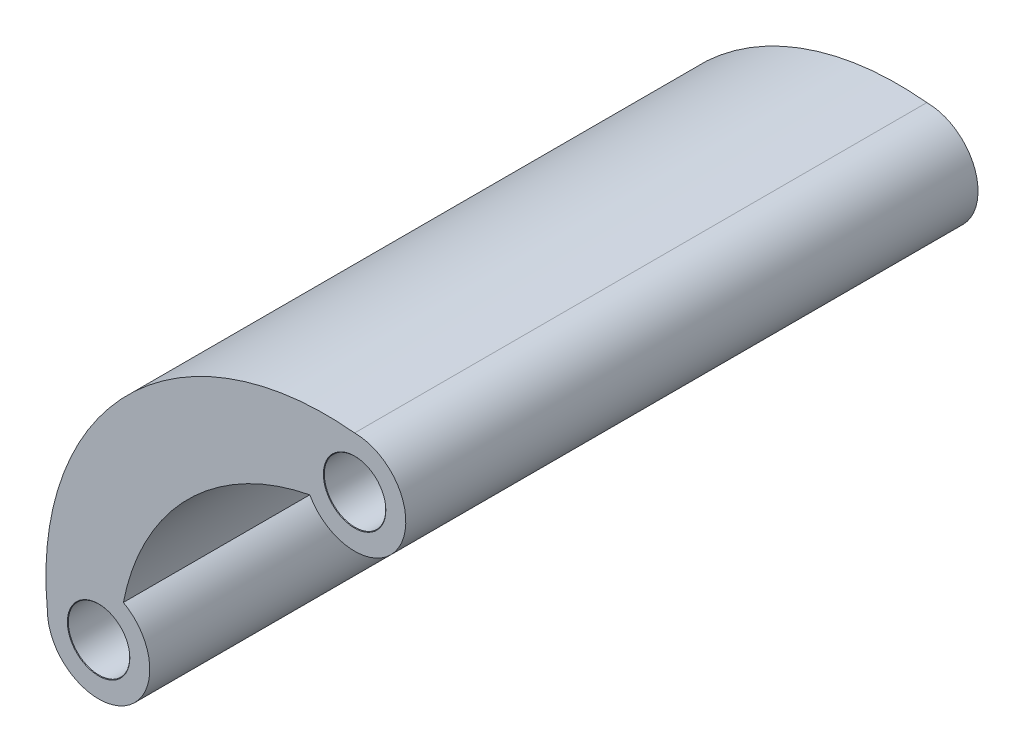
ISO-10303-21;
HEADER;
FILE_DESCRIPTION(('STEP AP214'),'2;1');
FILE_NAME('part.step','',(''),(''),'','','');
FILE_SCHEMA(('AUTOMOTIVE_DESIGN { 1 0 10303 214 1 1 1 1 }'));
ENDSEC;
DATA;
#1=APPLICATION_CONTEXT('core data for automotive mechanical design processes');
#2=APPLICATION_PROTOCOL_DEFINITION('international standard','automotive_design',2000,#1);
#3=PRODUCT_CONTEXT('',#1,'mechanical');
#4=PRODUCT('Part','Part','',(#3));
#5=PRODUCT_RELATED_PRODUCT_CATEGORY('part','',(#4));
#6=PRODUCT_DEFINITION_FORMATION('','',#4);
#7=PRODUCT_DEFINITION_CONTEXT('part definition',#1,'design');
#8=PRODUCT_DEFINITION('design','',#6,#7);
#9=PRODUCT_DEFINITION_SHAPE('','',#8);
#10=(LENGTH_UNIT() NAMED_UNIT(*) SI_UNIT(.MILLI.,.METRE.));
#11=(NAMED_UNIT(*) PLANE_ANGLE_UNIT() SI_UNIT($,.RADIAN.));
#12=(NAMED_UNIT(*) SI_UNIT($,.STERADIAN.) SOLID_ANGLE_UNIT());
#13=UNCERTAINTY_MEASURE_WITH_UNIT(LENGTH_MEASURE(1.E-05),#10,'distance_accuracy_value','');
#14=(GEOMETRIC_REPRESENTATION_CONTEXT(3) GLOBAL_UNCERTAINTY_ASSIGNED_CONTEXT((#13)) GLOBAL_UNIT_ASSIGNED_CONTEXT((#10,
#11,#12)) REPRESENTATION_CONTEXT('',''));
#15=CARTESIAN_POINT('',(0.,0.,0.));
#16=DIRECTION('',(0.,0.,1.));
#17=DIRECTION('',(1.,0.,0.));
#18=AXIS2_PLACEMENT_3D('',#15,#16,#17);
#19=CARTESIAN_POINT('',(-12.5,0.,27.94));
#20=DIRECTION('',(0.,0.,-1.));
#21=DIRECTION('',(-1.,0.,0.));
#22=AXIS2_PLACEMENT_3D('',#19,#20,#21);
#23=CYLINDRICAL_SURFACE('',#22,2.5);
#24=CARTESIAN_POINT('',(-12.5,0.,0.));
#25=DIRECTION('',(0.,0.,1.));
#26=DIRECTION('',(1.,0.,0.));
#27=AXIS2_PLACEMENT_3D('',#24,#25,#26);
#28=CIRCLE('',#27,2.5);
#29=CARTESIAN_POINT('',(-15.,0.,0.));
#30=VERTEX_POINT('',#29);
#31=CARTESIAN_POINT('',(-11.29,2.1876699933948,0.));
#32=VERTEX_POINT('',#31);
#33=EDGE_CURVE('E115',#30,#32,#28,.T.);
#34=ORIENTED_EDGE('',*,*,#33,.T.);
#35=DIRECTION('',(0.,0.,-1.));
#36=VECTOR('',#35,1.);
#37=CARTESIAN_POINT('',(-11.29,2.1876699933948,27.94));
#38=LINE('',#37,#36);
#39=CARTESIAN_POINT('',(-11.29,2.1876699933948,27.94));
#40=VERTEX_POINT('',#39);
#41=EDGE_CURVE('E11',#40,#32,#38,.T.);
#42=ORIENTED_EDGE('',*,*,#41,.F.);
#43=CARTESIAN_POINT('',(-12.5,0.,27.94));
#44=DIRECTION('',(0.,0.,1.));
#45=DIRECTION('',(1.,0.,0.));
#46=AXIS2_PLACEMENT_3D('',#43,#44,#45);
#47=CIRCLE('',#46,2.5);
#48=CARTESIAN_POINT('',(-15.,0.,27.94));
#49=VERTEX_POINT('',#48);
#50=EDGE_CURVE('E97',#49,#40,#47,.T.);
#51=ORIENTED_EDGE('',*,*,#50,.F.);
#52=DIRECTION('',(0.,0.,-1.));
#53=VECTOR('',#52,1.);
#54=CARTESIAN_POINT('',(-15.,0.,27.94));
#55=LINE('',#54,#53);
#56=EDGE_CURVE('E64',#49,#30,#55,.T.);
#57=ORIENTED_EDGE('',*,*,#56,.T.);
#58=EDGE_LOOP('',(#34,#42,#51,#57));
#59=FACE_BOUND('',#58,.T.);
#60=ADVANCED_FACE('F47',(#59),#23,.T.);
#61=CARTESIAN_POINT('',(0.,0.,27.94));
#62=DIRECTION('',(0.,0.,-1.));
#63=DIRECTION('',(-1.,0.,0.));
#64=AXIS2_PLACEMENT_3D('',#61,#62,#63);
#65=CYLINDRICAL_SURFACE('',#64,11.5);
#66=CARTESIAN_POINT('',(0.,0.,0.));
#67=DIRECTION('',(0.,0.,1.));
#68=DIRECTION('',(1.,0.,0.));
#69=AXIS2_PLACEMENT_3D('',#66,#67,#68);
#70=CIRCLE('',#69,11.5);
#71=CARTESIAN_POINT('',(-2.1876699933948,11.29,0.));
#72=VERTEX_POINT('',#71);
#73=EDGE_CURVE('E103',#32,#72,#70,.F.);
#74=ORIENTED_EDGE('',*,*,#73,.T.);
#75=DIRECTION('',(0.,0.,-1.));
#76=VECTOR('',#75,1.);
#77=CARTESIAN_POINT('',(-2.1876699933948,11.29,27.94));
#78=LINE('',#77,#76);
#79=CARTESIAN_POINT('',(-2.1876699933948,11.29,27.94));
#80=VERTEX_POINT('',#79);
#81=EDGE_CURVE('E56',#80,#72,#78,.T.);
#82=ORIENTED_EDGE('',*,*,#81,.F.);
#83=CARTESIAN_POINT('',(0.,0.,27.94));
#84=DIRECTION('',(0.,0.,1.));
#85=DIRECTION('',(1.,0.,0.));
#86=AXIS2_PLACEMENT_3D('',#83,#84,#85);
#87=CIRCLE('',#86,11.5);
#88=EDGE_CURVE('E90',#40,#80,#87,.F.);
#89=ORIENTED_EDGE('',*,*,#88,.F.);
#90=ORIENTED_EDGE('',*,*,#41,.T.);
#91=EDGE_LOOP('',(#74,#82,#89,#90));
#92=FACE_BOUND('',#91,.T.);
#93=ADVANCED_FACE('F102',(#92),#65,.F.);
#94=CARTESIAN_POINT('',(0.,12.5,27.94));
#95=DIRECTION('',(0.,0.,-1.));
#96=DIRECTION('',(-1.,0.,0.));
#97=AXIS2_PLACEMENT_3D('',#94,#95,#96);
#98=CYLINDRICAL_SURFACE('',#97,2.5);
#99=CARTESIAN_POINT('',(0.,12.5,0.));
#100=DIRECTION('',(0.,0.,1.));
#101=DIRECTION('',(1.,0.,0.));
#102=AXIS2_PLACEMENT_3D('',#99,#100,#101);
#103=CIRCLE('',#102,2.5);
#104=CARTESIAN_POINT('',(0.,15.,0.));
#105=VERTEX_POINT('',#104);
#106=EDGE_CURVE('E121',#72,#105,#103,.T.);
#107=ORIENTED_EDGE('',*,*,#106,.T.);
#108=DIRECTION('',(0.,0.,-1.));
#109=VECTOR('',#108,1.);
#110=CARTESIAN_POINT('',(0.,15.,27.94));
#111=LINE('',#110,#109);
#112=CARTESIAN_POINT('',(0.,15.,27.94));
#113=VERTEX_POINT('',#112);
#114=EDGE_CURVE('E79',#113,#105,#111,.T.);
#115=ORIENTED_EDGE('',*,*,#114,.F.);
#116=CARTESIAN_POINT('',(0.,12.5,27.94));
#117=DIRECTION('',(0.,0.,1.));
#118=DIRECTION('',(1.,0.,0.));
#119=AXIS2_PLACEMENT_3D('',#116,#117,#118);
#120=CIRCLE('',#119,2.5);
#121=EDGE_CURVE('E96',#80,#113,#120,.T.);
#122=ORIENTED_EDGE('',*,*,#121,.F.);
#123=ORIENTED_EDGE('',*,*,#81,.T.);
#124=EDGE_LOOP('',(#107,#115,#122,#123));
#125=FACE_BOUND('',#124,.T.);
#126=ADVANCED_FACE('F107',(#125),#98,.T.);
#127=CARTESIAN_POINT('',(-1.4142135623731,1.41421356237309,27.94));
#128=DIRECTION('',(0.,0.,-1.));
#129=DIRECTION('',(-1.,0.,0.));
#130=AXIS2_PLACEMENT_3D('',#127,#128,#129);
#131=CYLINDRICAL_SURFACE('',#130,13.6591944538764);
#132=CARTESIAN_POINT('',(-1.4142135623731,1.41421356237309,0.));
#133=DIRECTION('',(0.,0.,1.));
#134=DIRECTION('',(1.,0.,0.));
#135=AXIS2_PLACEMENT_3D('',#132,#133,#134);
#136=CIRCLE('',#135,13.6591944538764);
#137=EDGE_CURVE('E124',#30,#105,#136,.F.);
#138=ORIENTED_EDGE('',*,*,#137,.F.);
#139=ORIENTED_EDGE('',*,*,#56,.F.);
#140=CARTESIAN_POINT('',(-1.4142135623731,1.41421356237309,27.94));
#141=DIRECTION('',(0.,0.,1.));
#142=DIRECTION('',(1.,0.,0.));
#143=AXIS2_PLACEMENT_3D('',#140,#141,#142);
#144=CIRCLE('',#143,13.6591944538764);
#145=EDGE_CURVE('E109',#49,#113,#144,.F.);
#146=ORIENTED_EDGE('',*,*,#145,.T.);
#147=ORIENTED_EDGE('',*,*,#114,.T.);
#148=EDGE_LOOP('',(#138,#139,#146,#147));
#149=FACE_BOUND('',#148,.T.);
#150=ADVANCED_FACE('F163',(#149),#131,.T.);
#151=CARTESIAN_POINT('',(0.,0.,27.94));
#152=DIRECTION('',(0.,0.,1.));
#153=DIRECTION('',(1.,0.,0.));
#154=AXIS2_PLACEMENT_3D('',#151,#152,#153);
#155=PLANE('',#154);
#156=CARTESIAN_POINT('',(0.,12.5,27.94));
#157=DIRECTION('',(0.,0.,1.));
#158=DIRECTION('',(1.,0.,0.));
#159=AXIS2_PLACEMENT_3D('',#156,#157,#158);
#160=CIRCLE('',#159,1.525);
#161=CARTESIAN_POINT('',(1.525,12.5,27.94));
#162=VERTEX_POINT('',#161);
#163=EDGE_CURVE('E153',#162,#162,#160,.T.);
#164=ORIENTED_EDGE('',*,*,#163,.F.);
#165=EDGE_LOOP('',(#164));
#166=FACE_BOUND('',#165,.T.);
#167=CARTESIAN_POINT('',(-12.5,0.,27.94));
#168=DIRECTION('',(0.,0.,1.));
#169=DIRECTION('',(1.,0.,0.));
#170=AXIS2_PLACEMENT_3D('',#167,#168,#169);
#171=CIRCLE('',#170,1.525);
#172=CARTESIAN_POINT('',(-10.975,0.,27.94));
#173=VERTEX_POINT('',#172);
#174=EDGE_CURVE('E141',#173,#173,#171,.T.);
#175=ORIENTED_EDGE('',*,*,#174,.F.);
#176=EDGE_LOOP('',(#175));
#177=FACE_BOUND('',#176,.T.);
#178=ORIENTED_EDGE('',*,*,#50,.T.);
#179=ORIENTED_EDGE('',*,*,#88,.T.);
#180=ORIENTED_EDGE('',*,*,#121,.T.);
#181=ORIENTED_EDGE('',*,*,#145,.F.);
#182=EDGE_LOOP('',(#178,#179,#180,#181));
#183=FACE_BOUND('',#182,.T.);
#184=ADVANCED_FACE('F93',(#166,#177,#183),#155,.T.);
#185=CARTESIAN_POINT('',(0.,0.,0.));
#186=DIRECTION('',(0.,0.,1.));
#187=DIRECTION('',(1.,0.,0.));
#188=AXIS2_PLACEMENT_3D('',#185,#186,#187);
#189=PLANE('',#188);
#190=CARTESIAN_POINT('',(0.,12.5,0.));
#191=DIRECTION('',(0.,0.,1.));
#192=DIRECTION('',(1.,0.,0.));
#193=AXIS2_PLACEMENT_3D('',#190,#191,#192);
#194=CIRCLE('',#193,1.5);
#195=CARTESIAN_POINT('',(1.5,12.5,0.));
#196=VERTEX_POINT('',#195);
#197=EDGE_CURVE('E145',#196,#196,#194,.T.);
#198=ORIENTED_EDGE('',*,*,#197,.T.);
#199=EDGE_LOOP('',(#198));
#200=FACE_BOUND('',#199,.T.);
#201=CARTESIAN_POINT('',(-12.5,0.,0.));
#202=DIRECTION('',(0.,0.,1.));
#203=DIRECTION('',(1.,0.,0.));
#204=AXIS2_PLACEMENT_3D('',#201,#202,#203);
#205=CIRCLE('',#204,1.5);
#206=CARTESIAN_POINT('',(-11.,0.,0.));
#207=VERTEX_POINT('',#206);
#208=EDGE_CURVE('E118',#207,#207,#205,.T.);
#209=ORIENTED_EDGE('',*,*,#208,.T.);
#210=EDGE_LOOP('',(#209));
#211=FACE_BOUND('',#210,.T.);
#212=ORIENTED_EDGE('',*,*,#33,.F.);
#213=ORIENTED_EDGE('',*,*,#137,.T.);
#214=ORIENTED_EDGE('',*,*,#106,.F.);
#215=ORIENTED_EDGE('',*,*,#73,.F.);
#216=EDGE_LOOP('',(#212,#213,#214,#215));
#217=FACE_BOUND('',#216,.T.);
#218=ADVANCED_FACE('F162',(#200,#211,#217),#189,.F.);
#219=CARTESIAN_POINT('',(-12.5,0.,27.94));
#220=DIRECTION('',(0.,0.,1.));
#221=DIRECTION('',(1.,0.,0.));
#222=AXIS2_PLACEMENT_3D('',#219,#220,#221);
#223=CYLINDRICAL_SURFACE('',#222,1.5);
#224=ORIENTED_EDGE('',*,*,#208,.F.);
#225=EDGE_LOOP('',(#224));
#226=FACE_BOUND('',#225,.T.);
#227=CARTESIAN_POINT('',(-12.5,0.,27.9190225092206));
#228=DIRECTION('',(0.,0.,1.));
#229=DIRECTION('',(1.,0.,0.));
#230=AXIS2_PLACEMENT_3D('',#227,#228,#229);
#231=CIRCLE('',#230,1.5);
#232=CARTESIAN_POINT('',(-11.,0.,27.9190225092206));
#233=VERTEX_POINT('',#232);
#234=EDGE_CURVE('E137',#233,#233,#231,.T.);
#235=ORIENTED_EDGE('',*,*,#234,.T.);
#236=EDGE_LOOP('',(#235));
#237=FACE_BOUND('',#236,.T.);
#238=ADVANCED_FACE('F170',(#226,#237),#223,.F.);
#239=CARTESIAN_POINT('',(-12.5,0.,27.94));
#240=DIRECTION('',(0.,0.,1.));
#241=DIRECTION('',(1.,0.,0.));
#242=AXIS2_PLACEMENT_3D('',#239,#240,#241);
#243=CONICAL_SURFACE('',#242,1.525,0.872664625997111);
#244=ORIENTED_EDGE('',*,*,#234,.F.);
#245=EDGE_LOOP('',(#244));
#246=FACE_BOUND('',#245,.T.);
#247=ORIENTED_EDGE('',*,*,#174,.T.);
#248=EDGE_LOOP('',(#247));
#249=FACE_BOUND('',#248,.T.);
#250=ADVANCED_FACE('F167',(#246,#249),#243,.F.);
#251=CARTESIAN_POINT('',(0.,12.5,27.94));
#252=DIRECTION('',(0.,0.,1.));
#253=DIRECTION('',(1.,0.,0.));
#254=AXIS2_PLACEMENT_3D('',#251,#252,#253);
#255=CYLINDRICAL_SURFACE('',#254,1.5);
#256=ORIENTED_EDGE('',*,*,#197,.F.);
#257=EDGE_LOOP('',(#256));
#258=FACE_BOUND('',#257,.T.);
#259=CARTESIAN_POINT('',(0.,12.5,27.9190225092206));
#260=DIRECTION('',(0.,0.,1.));
#261=DIRECTION('',(1.,0.,0.));
#262=AXIS2_PLACEMENT_3D('',#259,#260,#261);
#263=CIRCLE('',#262,1.5);
#264=CARTESIAN_POINT('',(1.5,12.5,27.9190225092206));
#265=VERTEX_POINT('',#264);
#266=EDGE_CURVE('E149',#265,#265,#263,.T.);
#267=ORIENTED_EDGE('',*,*,#266,.T.);
#268=EDGE_LOOP('',(#267));
#269=FACE_BOUND('',#268,.T.);
#270=ADVANCED_FACE('F169',(#258,#269),#255,.F.);
#271=CARTESIAN_POINT('',(0.,12.5,27.94));
#272=DIRECTION('',(0.,0.,1.));
#273=DIRECTION('',(1.,0.,0.));
#274=AXIS2_PLACEMENT_3D('',#271,#272,#273);
#275=CONICAL_SURFACE('',#274,1.525,0.872664625997111);
#276=ORIENTED_EDGE('',*,*,#266,.F.);
#277=EDGE_LOOP('',(#276));
#278=FACE_BOUND('',#277,.T.);
#279=ORIENTED_EDGE('',*,*,#163,.T.);
#280=EDGE_LOOP('',(#279));
#281=FACE_BOUND('',#280,.T.);
#282=ADVANCED_FACE('F158',(#278,#281),#275,.F.);
#283=CLOSED_SHELL('',(#60,#93,#126,#150,#184,#218,#238,#250,#270,#282));
#284=MANIFOLD_SOLID_BREP('B2',#283);
#285=ADVANCED_BREP_SHAPE_REPRESENTATION('',(#18,#284),#14);
#286=SHAPE_DEFINITION_REPRESENTATION(#9,#285);
ENDSEC;
END-ISO-10303-21;
